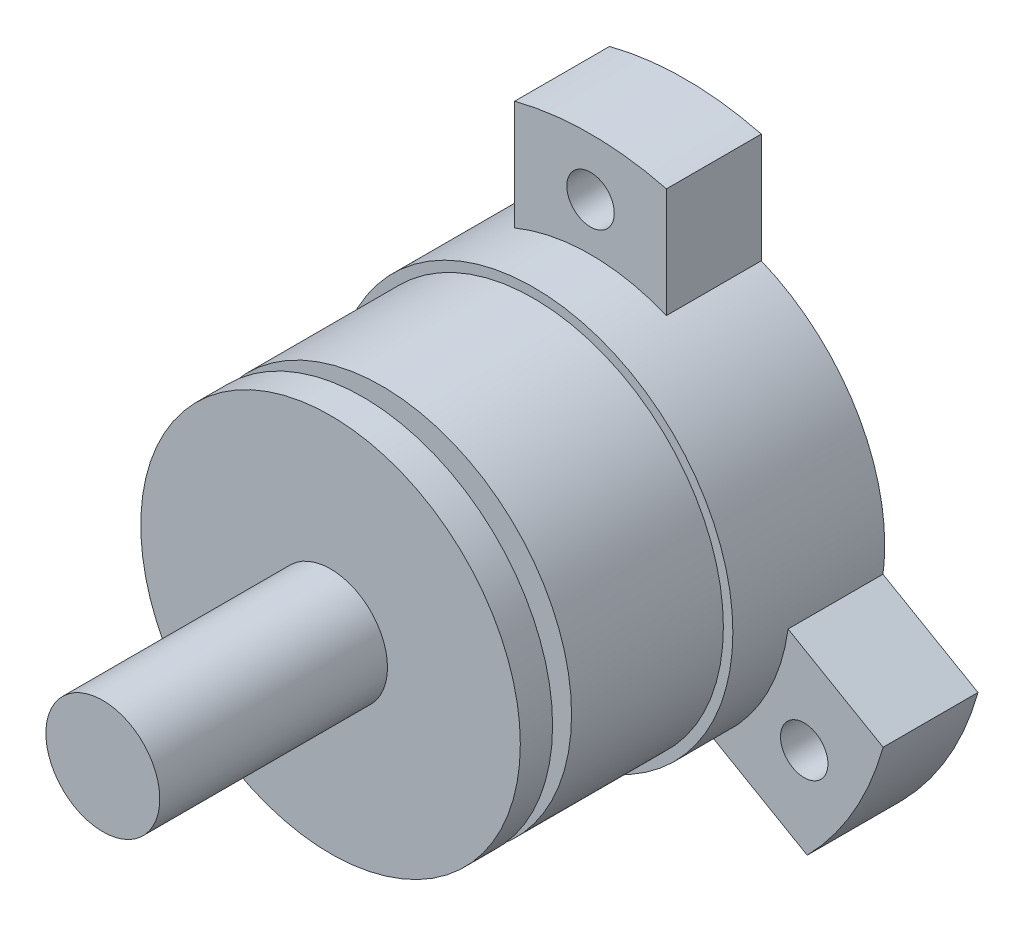
ISO-10303-21;
HEADER;
FILE_DESCRIPTION(('STEP AP214'),'2;1');
FILE_NAME('part.step','',(''),(''),'','','');
FILE_SCHEMA(('AUTOMOTIVE_DESIGN { 1 0 10303 214 1 1 1 1 }'));
ENDSEC;
DATA;
#1=APPLICATION_CONTEXT('core data for automotive mechanical design processes');
#2=APPLICATION_PROTOCOL_DEFINITION('international standard','automotive_design',2000,#1);
#3=PRODUCT_CONTEXT('',#1,'mechanical');
#4=PRODUCT('Part','Part','',(#3));
#5=PRODUCT_RELATED_PRODUCT_CATEGORY('part','',(#4));
#6=PRODUCT_DEFINITION_FORMATION('','',#4);
#7=PRODUCT_DEFINITION_CONTEXT('part definition',#1,'design');
#8=PRODUCT_DEFINITION('design','',#6,#7);
#9=PRODUCT_DEFINITION_SHAPE('','',#8);
#10=(LENGTH_UNIT() NAMED_UNIT(*) SI_UNIT(.MILLI.,.METRE.));
#11=(NAMED_UNIT(*) PLANE_ANGLE_UNIT() SI_UNIT($,.RADIAN.));
#12=(NAMED_UNIT(*) SI_UNIT($,.STERADIAN.) SOLID_ANGLE_UNIT());
#13=UNCERTAINTY_MEASURE_WITH_UNIT(LENGTH_MEASURE(1.E-05),#10,'distance_accuracy_value','');
#14=(GEOMETRIC_REPRESENTATION_CONTEXT(3) GLOBAL_UNCERTAINTY_ASSIGNED_CONTEXT((#13)) GLOBAL_UNIT_ASSIGNED_CONTEXT((#10,
#11,#12)) REPRESENTATION_CONTEXT('',''));
#15=CARTESIAN_POINT('',(0.,0.,0.));
#16=DIRECTION('',(0.,0.,1.));
#17=DIRECTION('',(1.,0.,0.));
#18=AXIS2_PLACEMENT_3D('',#15,#16,#17);
#19=CARTESIAN_POINT('',(0.,7.5,2.));
#20=DIRECTION('',(0.,0.,1.));
#21=DIRECTION('',(-1.,0.,0.));
#22=AXIS2_PLACEMENT_3D('',#19,#20,#21);
#23=PLANE('',#22);
#24=CARTESIAN_POINT('',(0.,0.,2.));
#25=DIRECTION('',(0.,0.,1.));
#26=DIRECTION('',(1.,0.,0.));
#27=AXIS2_PLACEMENT_3D('',#24,#25,#26);
#28=CIRCLE('',#27,7.5);
#29=CARTESIAN_POINT('',(7.5,0.,2.));
#30=VERTEX_POINT('',#29);
#31=EDGE_CURVE('E252',#30,#30,#28,.T.);
#32=ORIENTED_EDGE('',*,*,#31,.T.);
#33=EDGE_LOOP('',(#32));
#34=FACE_BOUND('',#33,.T.);
#35=CARTESIAN_POINT('',(-11.2583302491974,-6.50000000000017,2.));
#36=DIRECTION('',(0.,0.,1.));
#37=DIRECTION('',(1.,0.,0.));
#38=AXIS2_PLACEMENT_3D('',#35,#36,#37);
#39=CIRCLE('',#38,1.25);
#40=CARTESIAN_POINT('',(-10.0083302491974,-6.50000000000017,2.));
#41=VERTEX_POINT('',#40);
#42=EDGE_CURVE('E210',#41,#41,#39,.T.);
#43=ORIENTED_EDGE('',*,*,#42,.T.);
#44=EDGE_LOOP('',(#43));
#45=FACE_BOUND('',#44,.T.);
#46=CARTESIAN_POINT('',(11.258330249198,-6.49999999999983,2.));
#47=DIRECTION('',(0.,0.,1.));
#48=DIRECTION('',(1.,0.,0.));
#49=AXIS2_PLACEMENT_3D('',#46,#47,#48);
#50=CIRCLE('',#49,1.25);
#51=CARTESIAN_POINT('',(12.508330249198,-6.49999999999983,2.));
#52=VERTEX_POINT('',#51);
#53=EDGE_CURVE('E204',#52,#52,#50,.T.);
#54=ORIENTED_EDGE('',*,*,#53,.T.);
#55=EDGE_LOOP('',(#54));
#56=FACE_BOUND('',#55,.T.);
#57=CARTESIAN_POINT('',(0.,13.,2.));
#58=DIRECTION('',(0.,0.,1.));
#59=DIRECTION('',(1.,0.,0.));
#60=AXIS2_PLACEMENT_3D('',#57,#58,#59);
#61=CIRCLE('',#60,1.25);
#62=CARTESIAN_POINT('',(1.25,13.,2.));
#63=VERTEX_POINT('',#62);
#64=EDGE_CURVE('E199',#63,#63,#61,.T.);
#65=ORIENTED_EDGE('',*,*,#64,.T.);
#66=EDGE_LOOP('',(#65));
#67=FACE_BOUND('',#66,.T.);
#68=DIRECTION('',(0.,-1.,0.));
#69=VECTOR('',#68,1.);
#70=CARTESIAN_POINT('',(-4.,15.4919333848297,2.));
#71=LINE('',#70,#69);
#72=CARTESIAN_POINT('',(-4.,15.4919333848297,2.));
#73=VERTEX_POINT('',#72);
#74=CARTESIAN_POINT('',(-4.,9.7082439194738,2.));
#75=VERTEX_POINT('',#74);
#76=EDGE_CURVE('E145',#73,#75,#71,.T.);
#77=ORIENTED_EDGE('',*,*,#76,.F.);
#78=CARTESIAN_POINT('',(0.,0.,2.));
#79=DIRECTION('',(0.,0.,1.));
#80=DIRECTION('',(1.,0.,0.));
#81=AXIS2_PLACEMENT_3D('',#78,#79,#80);
#82=CIRCLE('',#81,16.);
#83=CARTESIAN_POINT('',(4.,15.4919333848297,2.));
#84=VERTEX_POINT('',#83);
#85=EDGE_CURVE('E250',#84,#73,#82,.T.);
#86=ORIENTED_EDGE('',*,*,#85,.F.);
#87=DIRECTION('',(0.,1.,0.));
#88=VECTOR('',#87,1.);
#89=CARTESIAN_POINT('',(4.,15.4919333848297,2.));
#90=LINE('',#89,#88);
#91=CARTESIAN_POINT('',(4.,9.7082439194738,2.));
#92=VERTEX_POINT('',#91);
#93=EDGE_CURVE('E176',#92,#84,#90,.T.);
#94=ORIENTED_EDGE('',*,*,#93,.F.);
#95=CARTESIAN_POINT('',(0.,0.,2.));
#96=DIRECTION('',(0.,0.,1.));
#97=DIRECTION('',(1.,0.,0.));
#98=AXIS2_PLACEMENT_3D('',#95,#96,#97);
#99=CIRCLE('',#98,10.5);
#100=CARTESIAN_POINT('',(10.4075858604001,-1.39002034459915,2.));
#101=VERTEX_POINT('',#100);
#102=EDGE_CURVE('E173',#101,#92,#99,.T.);
#103=ORIENTED_EDGE('',*,*,#102,.F.);
#104=DIRECTION('',(-0.866025403784432,0.500000000000011,0.));
#105=VECTOR('',#104,1.);
#106=CARTESIAN_POINT('',(15.4164078649987,-4.28186507727715,2.));
#107=LINE('',#106,#105);
#108=CARTESIAN_POINT('',(15.4164078649987,-4.28186507727715,2.));
#109=VERTEX_POINT('',#108);
#110=EDGE_CURVE('E171',#109,#101,#107,.T.);
#111=ORIENTED_EDGE('',*,*,#110,.F.);
#112=CARTESIAN_POINT('',(11.4164078649987,-11.2100683075526,2.));
#113=VERTEX_POINT('',#112);
#114=EDGE_CURVE('E248',#113,#109,#82,.T.);
#115=ORIENTED_EDGE('',*,*,#114,.F.);
#116=DIRECTION('',(0.866025403784432,-0.500000000000011,0.));
#117=VECTOR('',#116,1.);
#118=CARTESIAN_POINT('',(11.4164078649987,-11.2100683075526,2.));
#119=LINE('',#118,#117);
#120=CARTESIAN_POINT('',(6.40758586040012,-8.31822357487465,2.));
#121=VERTEX_POINT('',#120);
#122=EDGE_CURVE('E168',#121,#113,#119,.T.);
#123=ORIENTED_EDGE('',*,*,#122,.F.);
#124=CARTESIAN_POINT('',(0.,0.,2.));
#125=DIRECTION('',(0.,0.,1.));
#126=DIRECTION('',(1.,0.,0.));
#127=AXIS2_PLACEMENT_3D('',#124,#125,#126);
#128=CIRCLE('',#127,10.5);
#129=CARTESIAN_POINT('',(-6.40758586040012,-8.31822357487466,2.));
#130=VERTEX_POINT('',#129);
#131=EDGE_CURVE('E165',#130,#121,#128,.T.);
#132=ORIENTED_EDGE('',*,*,#131,.F.);
#133=DIRECTION('',(0.866025403784417,0.500000000000038,0.));
#134=VECTOR('',#133,1.);
#135=CARTESIAN_POINT('',(-11.4164078649985,-11.2100683075527,2.));
#136=LINE('',#135,#134);
#137=CARTESIAN_POINT('',(-11.4164078649985,-11.2100683075527,2.));
#138=VERTEX_POINT('',#137);
#139=EDGE_CURVE('E163',#138,#130,#136,.T.);
#140=ORIENTED_EDGE('',*,*,#139,.F.);
#141=CARTESIAN_POINT('',(-15.4164078649985,-4.28186507727724,2.));
#142=VERTEX_POINT('',#141);
#143=EDGE_CURVE('E253',#142,#138,#82,.T.);
#144=ORIENTED_EDGE('',*,*,#143,.F.);
#145=DIRECTION('',(-0.866025403784417,-0.500000000000038,0.));
#146=VECTOR('',#145,1.);
#147=CARTESIAN_POINT('',(-15.4164078649985,-4.28186507727723,2.));
#148=LINE('',#147,#146);
#149=CARTESIAN_POINT('',(-10.4075858604001,-1.39002034459915,2.));
#150=VERTEX_POINT('',#149);
#151=EDGE_CURVE('E148',#150,#142,#148,.T.);
#152=ORIENTED_EDGE('',*,*,#151,.F.);
#153=CARTESIAN_POINT('',(0.,0.,2.));
#154=DIRECTION('',(0.,0.,1.));
#155=DIRECTION('',(1.,0.,0.));
#156=AXIS2_PLACEMENT_3D('',#153,#154,#155);
#157=CIRCLE('',#156,10.5);
#158=EDGE_CURVE('E132',#75,#150,#157,.T.);
#159=ORIENTED_EDGE('',*,*,#158,.F.);
#160=EDGE_LOOP('',(#77,#86,#94,#103,#111,#115,#123,#132,#140,#144,#152,#159));
#161=FACE_BOUND('',#160,.T.);
#162=ADVANCED_FACE('F39',(#34,#45,#56,#67,#161),#23,.F.);
#163=CARTESIAN_POINT('',(0.,0.,0.));
#164=DIRECTION('',(0.,0.,-1.));
#165=DIRECTION('',(1.,0.,0.));
#166=AXIS2_PLACEMENT_3D('',#163,#164,#165);
#167=CYLINDRICAL_SURFACE('',#166,16.);
#168=DIRECTION('',(0.,0.,-1.));
#169=VECTOR('',#168,1.);
#170=CARTESIAN_POINT('',(-4.,15.4919333848297,54.8362015376415));
#171=LINE('',#170,#169);
#172=CARTESIAN_POINT('',(-4.,15.4919333848297,7.));
#173=VERTEX_POINT('',#172);
#174=EDGE_CURVE('E140',#173,#73,#171,.T.);
#175=ORIENTED_EDGE('',*,*,#174,.F.);
#176=CARTESIAN_POINT('',(0.,0.,7.));
#177=DIRECTION('',(0.,0.,1.));
#178=DIRECTION('',(1.,0.,0.));
#179=AXIS2_PLACEMENT_3D('',#176,#177,#178);
#180=CIRCLE('',#179,16.);
#181=CARTESIAN_POINT('',(4.,15.4919333848297,7.));
#182=VERTEX_POINT('',#181);
#183=EDGE_CURVE('E245',#182,#173,#180,.T.);
#184=ORIENTED_EDGE('',*,*,#183,.F.);
#185=DIRECTION('',(0.,0.,-1.));
#186=VECTOR('',#185,1.);
#187=CARTESIAN_POINT('',(4.,15.4919333848297,54.8362015376415));
#188=LINE('',#187,#186);
#189=EDGE_CURVE('E179',#182,#84,#188,.T.);
#190=ORIENTED_EDGE('',*,*,#189,.T.);
#191=ORIENTED_EDGE('',*,*,#85,.T.);
#192=EDGE_LOOP('',(#175,#184,#190,#191));
#193=FACE_BOUND('',#192,.T.);
#194=ADVANCED_FACE('F280',(#193),#167,.T.);
#195=DIRECTION('',(0.,0.,-1.));
#196=VECTOR('',#195,1.);
#197=CARTESIAN_POINT('',(-15.4164078649985,-4.28186507727724,54.8362015376415));
#198=LINE('',#197,#196);
#199=CARTESIAN_POINT('',(-15.4164078649985,-4.28186507727726,7.));
#200=VERTEX_POINT('',#199);
#201=EDGE_CURVE('E194',#200,#142,#198,.T.);
#202=ORIENTED_EDGE('',*,*,#201,.T.);
#203=ORIENTED_EDGE('',*,*,#143,.T.);
#204=DIRECTION('',(0.,0.,-1.));
#205=VECTOR('',#204,1.);
#206=CARTESIAN_POINT('',(-11.4164078649985,-11.2100683075527,54.8362015376415));
#207=LINE('',#206,#205);
#208=CARTESIAN_POINT('',(-11.4164078649984,-11.2100683075527,7.));
#209=VERTEX_POINT('',#208);
#210=EDGE_CURVE('E192',#209,#138,#207,.T.);
#211=ORIENTED_EDGE('',*,*,#210,.F.);
#212=EDGE_CURVE('E249',#200,#209,#180,.T.);
#213=ORIENTED_EDGE('',*,*,#212,.F.);
#214=EDGE_LOOP('',(#202,#203,#211,#213));
#215=FACE_BOUND('',#214,.T.);
#216=ADVANCED_FACE('F286',(#215),#167,.T.);
#217=DIRECTION('',(0.,0.,-1.));
#218=VECTOR('',#217,1.);
#219=CARTESIAN_POINT('',(11.4164078649987,-11.2100683075526,54.8362015376415));
#220=LINE('',#219,#218);
#221=CARTESIAN_POINT('',(11.4164078649987,-11.2100683075526,7.));
#222=VERTEX_POINT('',#221);
#223=EDGE_CURVE('E187',#222,#113,#220,.T.);
#224=ORIENTED_EDGE('',*,*,#223,.T.);
#225=ORIENTED_EDGE('',*,*,#114,.T.);
#226=DIRECTION('',(0.,0.,-1.));
#227=VECTOR('',#226,1.);
#228=CARTESIAN_POINT('',(15.4164078649987,-4.28186507727715,54.8362015376415));
#229=LINE('',#228,#227);
#230=CARTESIAN_POINT('',(15.4164078649987,-4.28186507727715,7.));
#231=VERTEX_POINT('',#230);
#232=EDGE_CURVE('E185',#231,#109,#229,.T.);
#233=ORIENTED_EDGE('',*,*,#232,.F.);
#234=EDGE_CURVE('E243',#222,#231,#180,.T.);
#235=ORIENTED_EDGE('',*,*,#234,.F.);
#236=EDGE_LOOP('',(#224,#225,#233,#235));
#237=FACE_BOUND('',#236,.T.);
#238=ADVANCED_FACE('F289',(#237),#167,.T.);
#239=CARTESIAN_POINT('',(0.,10.5,7.));
#240=DIRECTION('',(0.,0.,-1.));
#241=DIRECTION('',(1.,0.,0.));
#242=AXIS2_PLACEMENT_3D('',#239,#240,#241);
#243=PLANE('',#242);
#244=CARTESIAN_POINT('',(0.,13.,7.));
#245=DIRECTION('',(0.,0.,1.));
#246=DIRECTION('',(1.,0.,0.));
#247=AXIS2_PLACEMENT_3D('',#244,#245,#246);
#248=CIRCLE('',#247,1.24999999999999);
#249=CARTESIAN_POINT('',(1.24999999999999,13.,7.));
#250=VERTEX_POINT('',#249);
#251=EDGE_CURVE('E202',#250,#250,#248,.T.);
#252=ORIENTED_EDGE('',*,*,#251,.F.);
#253=EDGE_LOOP('',(#252));
#254=FACE_BOUND('',#253,.T.);
#255=DIRECTION('',(0.,1.,0.));
#256=VECTOR('',#255,1.);
#257=CARTESIAN_POINT('',(-4.,15.4919333848297,7.));
#258=LINE('',#257,#256);
#259=CARTESIAN_POINT('',(-4.,9.70824391947381,7.));
#260=VERTEX_POINT('',#259);
#261=EDGE_CURVE('E181',#260,#173,#258,.T.);
#262=ORIENTED_EDGE('',*,*,#261,.F.);
#263=CARTESIAN_POINT('',(0.,0.,7.));
#264=DIRECTION('',(0.,0.,1.));
#265=DIRECTION('',(1.,0.,0.));
#266=AXIS2_PLACEMENT_3D('',#263,#264,#265);
#267=CIRCLE('',#266,10.5);
#268=CARTESIAN_POINT('',(4.,9.7082439194738,7.));
#269=VERTEX_POINT('',#268);
#270=EDGE_CURVE('E135',#269,#260,#267,.T.);
#271=ORIENTED_EDGE('',*,*,#270,.F.);
#272=DIRECTION('',(0.,-1.,0.));
#273=VECTOR('',#272,1.);
#274=CARTESIAN_POINT('',(4.,15.4919333848297,7.));
#275=LINE('',#274,#273);
#276=EDGE_CURVE('E159',#182,#269,#275,.T.);
#277=ORIENTED_EDGE('',*,*,#276,.F.);
#278=ORIENTED_EDGE('',*,*,#183,.T.);
#279=EDGE_LOOP('',(#262,#271,#277,#278));
#280=FACE_BOUND('',#279,.T.);
#281=ADVANCED_FACE('F277',(#254,#280),#243,.F.);
#282=CARTESIAN_POINT('',(-11.2583302491974,-6.50000000000017,7.));
#283=DIRECTION('',(0.,0.,1.));
#284=DIRECTION('',(1.,0.,0.));
#285=AXIS2_PLACEMENT_3D('',#282,#283,#284);
#286=CIRCLE('',#285,1.24999999999999);
#287=CARTESIAN_POINT('',(-10.0083302491974,-6.50000000000017,7.));
#288=VERTEX_POINT('',#287);
#289=EDGE_CURVE('E213',#288,#288,#286,.T.);
#290=ORIENTED_EDGE('',*,*,#289,.F.);
#291=EDGE_LOOP('',(#290));
#292=FACE_BOUND('',#291,.T.);
#293=DIRECTION('',(0.866025403784417,0.500000000000038,0.));
#294=VECTOR('',#293,1.);
#295=CARTESIAN_POINT('',(-15.4164078649985,-4.28186507727723,7.));
#296=LINE('',#295,#294);
#297=CARTESIAN_POINT('',(-10.4075858604001,-1.39002034459915,7.));
#298=VERTEX_POINT('',#297);
#299=EDGE_CURVE('E203',#200,#298,#296,.T.);
#300=ORIENTED_EDGE('',*,*,#299,.F.);
#301=ORIENTED_EDGE('',*,*,#212,.T.);
#302=DIRECTION('',(-0.866025403784417,-0.500000000000038,0.));
#303=VECTOR('',#302,1.);
#304=CARTESIAN_POINT('',(-11.4164078649985,-11.2100683075527,7.));
#305=LINE('',#304,#303);
#306=CARTESIAN_POINT('',(-6.40758586040012,-8.31822357487466,7.));
#307=VERTEX_POINT('',#306);
#308=EDGE_CURVE('E380',#307,#209,#305,.T.);
#309=ORIENTED_EDGE('',*,*,#308,.F.);
#310=EDGE_CURVE('E244',#298,#307,#267,.T.);
#311=ORIENTED_EDGE('',*,*,#310,.F.);
#312=EDGE_LOOP('',(#300,#301,#309,#311));
#313=FACE_BOUND('',#312,.T.);
#314=ADVANCED_FACE('F274',(#292,#313),#243,.F.);
#315=CARTESIAN_POINT('',(11.258330249198,-6.49999999999983,7.));
#316=DIRECTION('',(0.,0.,1.));
#317=DIRECTION('',(1.,0.,0.));
#318=AXIS2_PLACEMENT_3D('',#315,#316,#317);
#319=CIRCLE('',#318,1.24999999999999);
#320=CARTESIAN_POINT('',(12.508330249198,-6.49999999999983,7.));
#321=VERTEX_POINT('',#320);
#322=EDGE_CURVE('E207',#321,#321,#319,.T.);
#323=ORIENTED_EDGE('',*,*,#322,.F.);
#324=EDGE_LOOP('',(#323));
#325=FACE_BOUND('',#324,.T.);
#326=DIRECTION('',(-0.866025403784432,0.500000000000011,0.));
#327=VECTOR('',#326,1.);
#328=CARTESIAN_POINT('',(11.4164078649987,-11.2100683075526,7.));
#329=LINE('',#328,#327);
#330=CARTESIAN_POINT('',(6.40758586040012,-8.31822357487465,7.));
#331=VERTEX_POINT('',#330);
#332=EDGE_CURVE('E382',#222,#331,#329,.T.);
#333=ORIENTED_EDGE('',*,*,#332,.F.);
#334=ORIENTED_EDGE('',*,*,#234,.T.);
#335=DIRECTION('',(0.866025403784432,-0.500000000000011,0.));
#336=VECTOR('',#335,1.);
#337=CARTESIAN_POINT('',(15.4164078649987,-4.28186507727715,7.));
#338=LINE('',#337,#336);
#339=CARTESIAN_POINT('',(10.4075858604001,-1.39002034459915,7.));
#340=VERTEX_POINT('',#339);
#341=EDGE_CURVE('E384',#340,#231,#338,.T.);
#342=ORIENTED_EDGE('',*,*,#341,.F.);
#343=EDGE_CURVE('E241',#331,#340,#267,.T.);
#344=ORIENTED_EDGE('',*,*,#343,.F.);
#345=EDGE_LOOP('',(#333,#334,#342,#344));
#346=FACE_BOUND('',#345,.T.);
#347=ADVANCED_FACE('F266',(#325,#346),#243,.F.);
#348=CARTESIAN_POINT('',(0.,0.,0.));
#349=DIRECTION('',(0.,0.,1.));
#350=DIRECTION('',(-1.,0.,0.));
#351=AXIS2_PLACEMENT_3D('',#348,#349,#350);
#352=PLANE('',#351);
#353=CARTESIAN_POINT('',(0.,0.,0.));
#354=DIRECTION('',(0.,0.,1.));
#355=DIRECTION('',(1.,0.,0.));
#356=AXIS2_PLACEMENT_3D('',#353,#354,#355);
#357=CIRCLE('',#356,5.);
#358=CARTESIAN_POINT('',(5.,0.,0.));
#359=VERTEX_POINT('',#358);
#360=EDGE_CURVE('E156',#359,#359,#357,.T.);
#361=ORIENTED_EDGE('',*,*,#360,.T.);
#362=EDGE_LOOP('',(#361));
#363=FACE_BOUND('',#362,.T.);
#364=CARTESIAN_POINT('',(0.,0.,0.));
#365=DIRECTION('',(0.,0.,-1.));
#366=DIRECTION('',(-1.,0.,0.));
#367=AXIS2_PLACEMENT_3D('',#364,#365,#366);
#368=CIRCLE('',#367,6.49999999999998);
#369=CARTESIAN_POINT('',(-6.49999999999998,0.,0.));
#370=VERTEX_POINT('',#369);
#371=EDGE_CURVE('E47',#370,#370,#368,.F.);
#372=ORIENTED_EDGE('',*,*,#371,.F.);
#373=EDGE_LOOP('',(#372));
#374=FACE_BOUND('',#373,.T.);
#375=ADVANCED_FACE('F263',(#363,#374),#352,.F.);
#376=CARTESIAN_POINT('',(0.,0.,0.));
#377=DIRECTION('',(0.,0.,-1.));
#378=DIRECTION('',(1.,0.,0.));
#379=AXIS2_PLACEMENT_3D('',#376,#377,#378);
#380=CYLINDRICAL_SURFACE('',#379,7.5);
#381=CARTESIAN_POINT('',(0.,0.,1.00000000000001));
#382=DIRECTION('',(0.,0.,-1.));
#383=DIRECTION('',(-1.,0.,0.));
#384=AXIS2_PLACEMENT_3D('',#381,#382,#383);
#385=CIRCLE('',#384,7.5);
#386=CARTESIAN_POINT('',(-7.5,0.,1.00000000000001));
#387=VERTEX_POINT('',#386);
#388=EDGE_CURVE('E11',#387,#387,#385,.T.);
#389=ORIENTED_EDGE('',*,*,#388,.F.);
#390=EDGE_LOOP('',(#389));
#391=FACE_BOUND('',#390,.T.);
#392=ORIENTED_EDGE('',*,*,#31,.F.);
#393=EDGE_LOOP('',(#392));
#394=FACE_BOUND('',#393,.T.);
#395=ADVANCED_FACE('F265',(#391,#394),#380,.T.);
#396=CARTESIAN_POINT('',(0.,0.,0.));
#397=DIRECTION('',(0.,0.,-1.));
#398=DIRECTION('',(1.,0.,0.));
#399=AXIS2_PLACEMENT_3D('',#396,#397,#398);
#400=CYLINDRICAL_SURFACE('',#399,10.5);
#401=ORIENTED_EDGE('',*,*,#270,.T.);
#402=DIRECTION('',(0.,0.,-1.));
#403=VECTOR('',#402,1.);
#404=CARTESIAN_POINT('',(-4.,9.7082439194738,54.8362015376415));
#405=LINE('',#404,#403);
#406=EDGE_CURVE('E128',#260,#75,#405,.T.);
#407=ORIENTED_EDGE('',*,*,#406,.T.);
#408=ORIENTED_EDGE('',*,*,#158,.T.);
#409=DIRECTION('',(0.,0.,-1.));
#410=VECTOR('',#409,1.);
#411=CARTESIAN_POINT('',(-10.4075858604001,-1.39002034459915,54.8362015376415));
#412=LINE('',#411,#410);
#413=EDGE_CURVE('E139',#298,#150,#412,.T.);
#414=ORIENTED_EDGE('',*,*,#413,.F.);
#415=ORIENTED_EDGE('',*,*,#310,.T.);
#416=DIRECTION('',(0.,0.,-1.));
#417=VECTOR('',#416,1.);
#418=CARTESIAN_POINT('',(-6.40758586040012,-8.31822357487466,54.8362015376415));
#419=LINE('',#418,#417);
#420=EDGE_CURVE('E62',#307,#130,#419,.T.);
#421=ORIENTED_EDGE('',*,*,#420,.T.);
#422=ORIENTED_EDGE('',*,*,#131,.T.);
#423=DIRECTION('',(0.,0.,-1.));
#424=VECTOR('',#423,1.);
#425=CARTESIAN_POINT('',(6.40758586040012,-8.31822357487465,54.8362015376415));
#426=LINE('',#425,#424);
#427=EDGE_CURVE('E189',#331,#121,#426,.T.);
#428=ORIENTED_EDGE('',*,*,#427,.F.);
#429=ORIENTED_EDGE('',*,*,#343,.T.);
#430=DIRECTION('',(0.,0.,-1.));
#431=VECTOR('',#430,1.);
#432=CARTESIAN_POINT('',(10.4075858604001,-1.39002034459915,54.8362015376415));
#433=LINE('',#432,#431);
#434=EDGE_CURVE('E54',#340,#101,#433,.T.);
#435=ORIENTED_EDGE('',*,*,#434,.T.);
#436=ORIENTED_EDGE('',*,*,#102,.T.);
#437=DIRECTION('',(0.,0.,-1.));
#438=VECTOR('',#437,1.);
#439=CARTESIAN_POINT('',(4.,9.7082439194738,54.8362015376415));
#440=LINE('',#439,#438);
#441=EDGE_CURVE('E182',#269,#92,#440,.T.);
#442=ORIENTED_EDGE('',*,*,#441,.F.);
#443=EDGE_LOOP('',(#401,#407,#408,#414,#415,#421,#422,#428,#429,#435,#436,#442));
#444=FACE_BOUND('',#443,.T.);
#445=CARTESIAN_POINT('',(0.,0.,10.));
#446=DIRECTION('',(0.,0.,1.));
#447=DIRECTION('',(1.,0.,0.));
#448=AXIS2_PLACEMENT_3D('',#445,#446,#447);
#449=CIRCLE('',#448,10.5);
#450=CARTESIAN_POINT('',(10.5,0.,10.));
#451=VERTEX_POINT('',#450);
#452=EDGE_CURVE('E238',#451,#451,#449,.T.);
#453=ORIENTED_EDGE('',*,*,#452,.F.);
#454=EDGE_LOOP('',(#453));
#455=FACE_BOUND('',#454,.T.);
#456=ADVANCED_FACE('F130',(#444,#455),#400,.T.);
#457=CARTESIAN_POINT('',(0.,10.5,10.));
#458=DIRECTION('',(0.,0.,-1.));
#459=DIRECTION('',(1.,0.,0.));
#460=AXIS2_PLACEMENT_3D('',#457,#458,#459);
#461=PLANE('',#460);
#462=ORIENTED_EDGE('',*,*,#452,.T.);
#463=EDGE_LOOP('',(#462));
#464=FACE_BOUND('',#463,.T.);
#465=CARTESIAN_POINT('',(0.,0.,10.));
#466=DIRECTION('',(0.,0.,1.));
#467=DIRECTION('',(1.,0.,0.));
#468=AXIS2_PLACEMENT_3D('',#465,#466,#467);
#469=CIRCLE('',#468,10.);
#470=CARTESIAN_POINT('',(10.,0.,10.));
#471=VERTEX_POINT('',#470);
#472=EDGE_CURVE('E235',#471,#471,#469,.T.);
#473=ORIENTED_EDGE('',*,*,#472,.F.);
#474=EDGE_LOOP('',(#473));
#475=FACE_BOUND('',#474,.T.);
#476=ADVANCED_FACE('F296',(#464,#475),#461,.F.);
#477=CARTESIAN_POINT('',(0.,0.,0.));
#478=DIRECTION('',(0.,0.,-1.));
#479=DIRECTION('',(1.,0.,0.));
#480=AXIS2_PLACEMENT_3D('',#477,#478,#479);
#481=CYLINDRICAL_SURFACE('',#480,10.);
#482=ORIENTED_EDGE('',*,*,#472,.T.);
#483=EDGE_LOOP('',(#482));
#484=FACE_BOUND('',#483,.T.);
#485=CARTESIAN_POINT('',(0.,0.,18.));
#486=DIRECTION('',(0.,0.,1.));
#487=DIRECTION('',(1.,0.,0.));
#488=AXIS2_PLACEMENT_3D('',#485,#486,#487);
#489=CIRCLE('',#488,10.);
#490=CARTESIAN_POINT('',(10.,0.,18.));
#491=VERTEX_POINT('',#490);
#492=EDGE_CURVE('E232',#491,#491,#489,.T.);
#493=ORIENTED_EDGE('',*,*,#492,.F.);
#494=EDGE_LOOP('',(#493));
#495=FACE_BOUND('',#494,.T.);
#496=ADVANCED_FACE('F299',(#484,#495),#481,.T.);
#497=CARTESIAN_POINT('',(0.,10.,18.));
#498=DIRECTION('',(0.,0.,-1.));
#499=DIRECTION('',(1.,0.,0.));
#500=AXIS2_PLACEMENT_3D('',#497,#498,#499);
#501=PLANE('',#500);
#502=ORIENTED_EDGE('',*,*,#492,.T.);
#503=EDGE_LOOP('',(#502));
#504=FACE_BOUND('',#503,.T.);
#505=CARTESIAN_POINT('',(0.,0.,18.));
#506=DIRECTION('',(0.,0.,1.));
#507=DIRECTION('',(1.,0.,0.));
#508=AXIS2_PLACEMENT_3D('',#505,#506,#507);
#509=CIRCLE('',#508,8.5);
#510=CARTESIAN_POINT('',(8.5,0.,18.));
#511=VERTEX_POINT('',#510);
#512=EDGE_CURVE('E229',#511,#511,#509,.T.);
#513=ORIENTED_EDGE('',*,*,#512,.F.);
#514=EDGE_LOOP('',(#513));
#515=FACE_BOUND('',#514,.T.);
#516=ADVANCED_FACE('F303',(#504,#515),#501,.F.);
#517=CARTESIAN_POINT('',(0.,0.,0.));
#518=DIRECTION('',(0.,0.,-1.));
#519=DIRECTION('',(1.,0.,0.));
#520=AXIS2_PLACEMENT_3D('',#517,#518,#519);
#521=CYLINDRICAL_SURFACE('',#520,8.5);
#522=ORIENTED_EDGE('',*,*,#512,.T.);
#523=EDGE_LOOP('',(#522));
#524=FACE_BOUND('',#523,.T.);
#525=CARTESIAN_POINT('',(0.,0.,19.));
#526=DIRECTION('',(0.,0.,1.));
#527=DIRECTION('',(1.,0.,0.));
#528=AXIS2_PLACEMENT_3D('',#525,#526,#527);
#529=CIRCLE('',#528,8.5);
#530=CARTESIAN_POINT('',(8.5,0.,19.));
#531=VERTEX_POINT('',#530);
#532=EDGE_CURVE('E226',#531,#531,#529,.T.);
#533=ORIENTED_EDGE('',*,*,#532,.F.);
#534=EDGE_LOOP('',(#533));
#535=FACE_BOUND('',#534,.T.);
#536=ADVANCED_FACE('F307',(#524,#535),#521,.T.);
#537=CARTESIAN_POINT('',(0.,10.,19.));
#538=DIRECTION('',(0.,0.,1.));
#539=DIRECTION('',(-1.,0.,0.));
#540=AXIS2_PLACEMENT_3D('',#537,#538,#539);
#541=PLANE('',#540);
#542=ORIENTED_EDGE('',*,*,#532,.T.);
#543=EDGE_LOOP('',(#542));
#544=FACE_BOUND('',#543,.T.);
#545=CARTESIAN_POINT('',(0.,0.,19.));
#546=DIRECTION('',(0.,0.,1.));
#547=DIRECTION('',(1.,0.,0.));
#548=AXIS2_PLACEMENT_3D('',#545,#546,#547);
#549=CIRCLE('',#548,10.);
#550=CARTESIAN_POINT('',(10.,0.,19.));
#551=VERTEX_POINT('',#550);
#552=EDGE_CURVE('E223',#551,#551,#549,.T.);
#553=ORIENTED_EDGE('',*,*,#552,.F.);
#554=EDGE_LOOP('',(#553));
#555=FACE_BOUND('',#554,.T.);
#556=ADVANCED_FACE('F311',(#544,#555),#541,.F.);
#557=CARTESIAN_POINT('',(0.,0.,0.));
#558=DIRECTION('',(0.,0.,-1.));
#559=DIRECTION('',(1.,0.,0.));
#560=AXIS2_PLACEMENT_3D('',#557,#558,#559);
#561=CYLINDRICAL_SURFACE('',#560,10.);
#562=ORIENTED_EDGE('',*,*,#552,.T.);
#563=EDGE_LOOP('',(#562));
#564=FACE_BOUND('',#563,.T.);
#565=CARTESIAN_POINT('',(0.,0.,20.7));
#566=DIRECTION('',(0.,0.,1.));
#567=DIRECTION('',(1.,0.,0.));
#568=AXIS2_PLACEMENT_3D('',#565,#566,#567);
#569=CIRCLE('',#568,10.);
#570=CARTESIAN_POINT('',(10.,0.,20.7));
#571=VERTEX_POINT('',#570);
#572=EDGE_CURVE('E220',#571,#571,#569,.T.);
#573=ORIENTED_EDGE('',*,*,#572,.F.);
#574=EDGE_LOOP('',(#573));
#575=FACE_BOUND('',#574,.T.);
#576=ADVANCED_FACE('F315',(#564,#575),#561,.T.);
#577=CARTESIAN_POINT('',(0.,2.99999999999999,20.7));
#578=DIRECTION('',(0.,0.,-1.));
#579=DIRECTION('',(1.,0.,0.));
#580=AXIS2_PLACEMENT_3D('',#577,#578,#579);
#581=PLANE('',#580);
#582=ORIENTED_EDGE('',*,*,#572,.T.);
#583=EDGE_LOOP('',(#582));
#584=FACE_BOUND('',#583,.T.);
#585=CARTESIAN_POINT('',(0.,0.,20.7));
#586=DIRECTION('',(0.,0.,1.));
#587=DIRECTION('',(1.,0.,0.));
#588=AXIS2_PLACEMENT_3D('',#585,#586,#587);
#589=CIRCLE('',#588,2.99999999999999);
#590=CARTESIAN_POINT('',(2.99999999999999,0.,20.7));
#591=VERTEX_POINT('',#590);
#592=EDGE_CURVE('E217',#591,#591,#589,.T.);
#593=ORIENTED_EDGE('',*,*,#592,.F.);
#594=EDGE_LOOP('',(#593));
#595=FACE_BOUND('',#594,.T.);
#596=ADVANCED_FACE('F319',(#584,#595),#581,.F.);
#597=CARTESIAN_POINT('',(0.,0.,0.));
#598=DIRECTION('',(0.,0.,-1.));
#599=DIRECTION('',(1.,0.,0.));
#600=AXIS2_PLACEMENT_3D('',#597,#598,#599);
#601=CYLINDRICAL_SURFACE('',#600,2.99999999999999);
#602=ORIENTED_EDGE('',*,*,#592,.T.);
#603=EDGE_LOOP('',(#602));
#604=FACE_BOUND('',#603,.T.);
#605=CARTESIAN_POINT('',(0.,0.,32.7));
#606=DIRECTION('',(0.,0.,1.));
#607=DIRECTION('',(1.,0.,0.));
#608=AXIS2_PLACEMENT_3D('',#605,#606,#607);
#609=CIRCLE('',#608,2.99999999999999);
#610=CARTESIAN_POINT('',(2.99999999999999,0.,32.7));
#611=VERTEX_POINT('',#610);
#612=EDGE_CURVE('E214',#611,#611,#609,.T.);
#613=ORIENTED_EDGE('',*,*,#612,.F.);
#614=EDGE_LOOP('',(#613));
#615=FACE_BOUND('',#614,.T.);
#616=ADVANCED_FACE('F323',(#604,#615),#601,.T.);
#617=CARTESIAN_POINT('',(0.,2.99999999999999,32.7));
#618=DIRECTION('',(0.,0.,-1.));
#619=DIRECTION('',(1.,0.,0.));
#620=AXIS2_PLACEMENT_3D('',#617,#618,#619);
#621=PLANE('',#620);
#622=ORIENTED_EDGE('',*,*,#612,.T.);
#623=EDGE_LOOP('',(#622));
#624=FACE_BOUND('',#623,.T.);
#625=ADVANCED_FACE('F327',(#624),#621,.F.);
#626=CARTESIAN_POINT('',(-11.2583302491974,-6.50000000000017,2.));
#627=DIRECTION('',(0.,0.,-1.));
#628=DIRECTION('',(1.,0.,0.));
#629=AXIS2_PLACEMENT_3D('',#626,#627,#628);
#630=CYLINDRICAL_SURFACE('',#629,1.24999999999999);
#631=ORIENTED_EDGE('',*,*,#42,.F.);
#632=EDGE_LOOP('',(#631));
#633=FACE_BOUND('',#632,.T.);
#634=ORIENTED_EDGE('',*,*,#289,.T.);
#635=EDGE_LOOP('',(#634));
#636=FACE_BOUND('',#635,.T.);
#637=ADVANCED_FACE('F331',(#633,#636),#630,.F.);
#638=CARTESIAN_POINT('',(11.258330249198,-6.49999999999983,2.));
#639=DIRECTION('',(0.,0.,-1.));
#640=DIRECTION('',(1.,0.,0.));
#641=AXIS2_PLACEMENT_3D('',#638,#639,#640);
#642=CYLINDRICAL_SURFACE('',#641,1.24999999999999);
#643=ORIENTED_EDGE('',*,*,#53,.F.);
#644=EDGE_LOOP('',(#643));
#645=FACE_BOUND('',#644,.T.);
#646=ORIENTED_EDGE('',*,*,#322,.T.);
#647=EDGE_LOOP('',(#646));
#648=FACE_BOUND('',#647,.T.);
#649=ADVANCED_FACE('F335',(#645,#648),#642,.F.);
#650=CARTESIAN_POINT('',(0.,13.,2.));
#651=DIRECTION('',(0.,0.,-1.));
#652=DIRECTION('',(1.,0.,0.));
#653=AXIS2_PLACEMENT_3D('',#650,#651,#652);
#654=CYLINDRICAL_SURFACE('',#653,1.24999999999999);
#655=ORIENTED_EDGE('',*,*,#64,.F.);
#656=EDGE_LOOP('',(#655));
#657=FACE_BOUND('',#656,.T.);
#658=ORIENTED_EDGE('',*,*,#251,.T.);
#659=EDGE_LOOP('',(#658));
#660=FACE_BOUND('',#659,.T.);
#661=ADVANCED_FACE('F339',(#657,#660),#654,.F.);
#662=CARTESIAN_POINT('',(4.,15.4919333848297,54.8362015376415));
#663=DIRECTION('',(1.,0.,0.));
#664=DIRECTION('',(0.,0.,1.));
#665=AXIS2_PLACEMENT_3D('',#662,#663,#664);
#666=PLANE('',#665);
#667=ORIENTED_EDGE('',*,*,#189,.F.);
#668=ORIENTED_EDGE('',*,*,#276,.T.);
#669=ORIENTED_EDGE('',*,*,#441,.T.);
#670=ORIENTED_EDGE('',*,*,#93,.T.);
#671=EDGE_LOOP('',(#667,#668,#669,#670));
#672=FACE_BOUND('',#671,.T.);
#673=ADVANCED_FACE('F343',(#672),#666,.T.);
#674=CARTESIAN_POINT('',(15.4164078649987,-4.28186507727715,54.8362015376415));
#675=DIRECTION('',(0.500000000000011,0.866025403784432,0.));
#676=DIRECTION('',(-0.866025403784432,0.500000000000011,0.));
#677=AXIS2_PLACEMENT_3D('',#674,#675,#676);
#678=PLANE('',#677);
#679=ORIENTED_EDGE('',*,*,#434,.F.);
#680=ORIENTED_EDGE('',*,*,#341,.T.);
#681=ORIENTED_EDGE('',*,*,#232,.T.);
#682=ORIENTED_EDGE('',*,*,#110,.T.);
#683=EDGE_LOOP('',(#679,#680,#681,#682));
#684=FACE_BOUND('',#683,.T.);
#685=ADVANCED_FACE('F357',(#684),#678,.T.);
#686=CARTESIAN_POINT('',(11.4164078649987,-11.2100683075526,54.8362015376415));
#687=DIRECTION('',(-0.500000000000011,-0.866025403784432,0.));
#688=DIRECTION('',(0.866025403784432,-0.500000000000011,0.));
#689=AXIS2_PLACEMENT_3D('',#686,#687,#688);
#690=PLANE('',#689);
#691=ORIENTED_EDGE('',*,*,#223,.F.);
#692=ORIENTED_EDGE('',*,*,#332,.T.);
#693=ORIENTED_EDGE('',*,*,#427,.T.);
#694=ORIENTED_EDGE('',*,*,#122,.T.);
#695=EDGE_LOOP('',(#691,#692,#693,#694));
#696=FACE_BOUND('',#695,.T.);
#697=ADVANCED_FACE('F354',(#696),#690,.T.);
#698=CARTESIAN_POINT('',(-11.4164078649985,-11.2100683075527,54.8362015376415));
#699=DIRECTION('',(0.500000000000037,-0.866025403784417,0.));
#700=DIRECTION('',(0.866025403784417,0.500000000000038,0.));
#701=AXIS2_PLACEMENT_3D('',#698,#699,#700);
#702=PLANE('',#701);
#703=ORIENTED_EDGE('',*,*,#420,.F.);
#704=ORIENTED_EDGE('',*,*,#308,.T.);
#705=ORIENTED_EDGE('',*,*,#210,.T.);
#706=ORIENTED_EDGE('',*,*,#139,.T.);
#707=EDGE_LOOP('',(#703,#704,#705,#706));
#708=FACE_BOUND('',#707,.T.);
#709=ADVANCED_FACE('F348',(#708),#702,.T.);
#710=CARTESIAN_POINT('',(-4.,15.4919333848297,54.8362015376415));
#711=DIRECTION('',(-1.,0.,0.));
#712=DIRECTION('',(0.,0.,-1.));
#713=AXIS2_PLACEMENT_3D('',#710,#711,#712);
#714=PLANE('',#713);
#715=ORIENTED_EDGE('',*,*,#406,.F.);
#716=ORIENTED_EDGE('',*,*,#261,.T.);
#717=ORIENTED_EDGE('',*,*,#174,.T.);
#718=ORIENTED_EDGE('',*,*,#76,.T.);
#719=EDGE_LOOP('',(#715,#716,#717,#718));
#720=FACE_BOUND('',#719,.T.);
#721=ADVANCED_FACE('F150',(#720),#714,.T.);
#722=CARTESIAN_POINT('',(-15.4164078649985,-4.28186507727723,54.8362015376415));
#723=DIRECTION('',(-0.500000000000038,0.866025403784417,0.));
#724=DIRECTION('',(-0.866025403784417,-0.500000000000038,0.));
#725=AXIS2_PLACEMENT_3D('',#722,#723,#724);
#726=PLANE('',#725);
#727=ORIENTED_EDGE('',*,*,#201,.F.);
#728=ORIENTED_EDGE('',*,*,#299,.T.);
#729=ORIENTED_EDGE('',*,*,#413,.T.);
#730=ORIENTED_EDGE('',*,*,#151,.T.);
#731=EDGE_LOOP('',(#727,#728,#729,#730));
#732=FACE_BOUND('',#731,.T.);
#733=ADVANCED_FACE('F347',(#732),#726,.T.);
#734=CARTESIAN_POINT('',(0.,0.,0.));
#735=DIRECTION('',(0.,0.,1.));
#736=DIRECTION('',(-1.,0.,0.));
#737=AXIS2_PLACEMENT_3D('',#734,#735,#736);
#738=CONICAL_SURFACE('',#737,6.49999999999998,0.78539816339745);
#739=ORIENTED_EDGE('',*,*,#388,.T.);
#740=EDGE_LOOP('',(#739));
#741=FACE_BOUND('',#740,.T.);
#742=ORIENTED_EDGE('',*,*,#371,.T.);
#743=EDGE_LOOP('',(#742));
#744=FACE_BOUND('',#743,.T.);
#745=ADVANCED_FACE('F41',(#741,#744),#738,.T.);
#746=CARTESIAN_POINT('',(0.,0.,14.));
#747=DIRECTION('',(0.,0.,-1.));
#748=DIRECTION('',(1.,0.,0.));
#749=AXIS2_PLACEMENT_3D('',#746,#747,#748);
#750=CYLINDRICAL_SURFACE('',#749,5.);
#751=CARTESIAN_POINT('',(0.,0.,14.));
#752=DIRECTION('',(0.,0.,1.));
#753=DIRECTION('',(1.,0.,0.));
#754=AXIS2_PLACEMENT_3D('',#751,#752,#753);
#755=CIRCLE('',#754,5.);
#756=CARTESIAN_POINT('',(5.,0.,14.));
#757=VERTEX_POINT('',#756);
#758=EDGE_CURVE('E153',#757,#757,#755,.T.);
#759=ORIENTED_EDGE('',*,*,#758,.T.);
#760=EDGE_LOOP('',(#759));
#761=FACE_BOUND('',#760,.T.);
#762=ORIENTED_EDGE('',*,*,#360,.F.);
#763=EDGE_LOOP('',(#762));
#764=FACE_BOUND('',#763,.T.);
#765=ADVANCED_FACE('F364',(#761,#764),#750,.F.);
#766=CARTESIAN_POINT('',(0.,0.,14.));
#767=DIRECTION('',(0.,0.,-1.));
#768=DIRECTION('',(1.,0.,0.));
#769=AXIS2_PLACEMENT_3D('',#766,#767,#768);
#770=PLANE('',#769);
#771=ORIENTED_EDGE('',*,*,#758,.F.);
#772=EDGE_LOOP('',(#771));
#773=FACE_BOUND('',#772,.T.);
#774=ADVANCED_FACE('F367',(#773),#770,.T.);
#775=CLOSED_SHELL('',(#162,#194,#216,#238,#281,#314,#347,#375,#395,#456,#476,#496,#516,#536,
#556,#576,#596,#616,#625,#637,#649,#661,#673,#685,#697,#709,#721,#733,#745,#765,#774));
#776=MANIFOLD_SOLID_BREP('B2',#775);
#777=ADVANCED_BREP_SHAPE_REPRESENTATION('',(#18,#776),#14);
#778=SHAPE_DEFINITION_REPRESENTATION(#9,#777);
ENDSEC;
END-ISO-10303-21;
